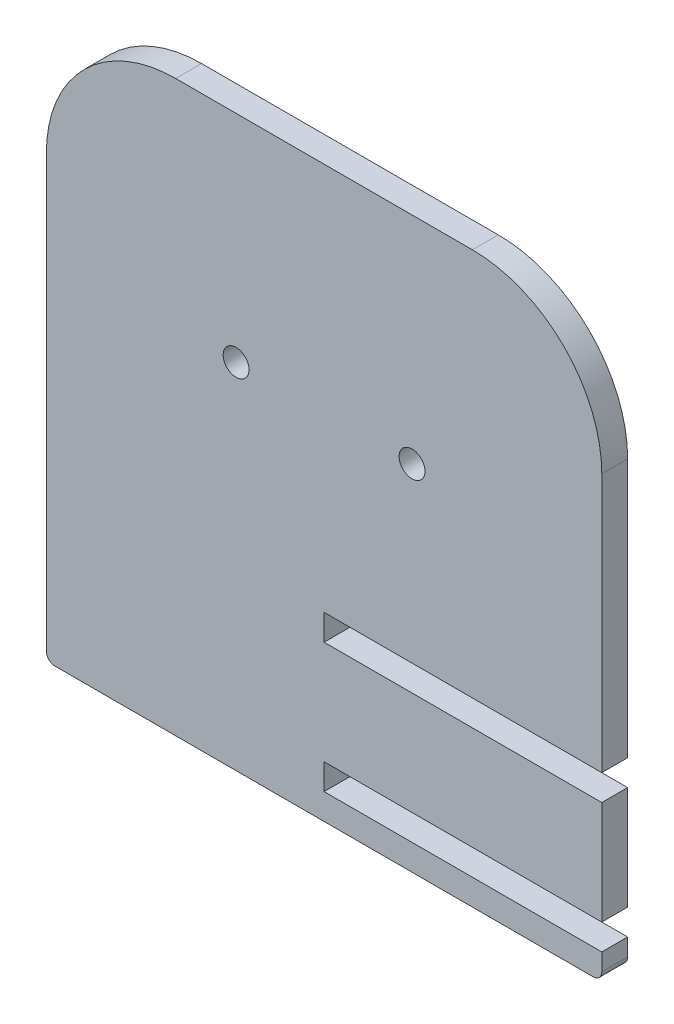
ISO-10303-21;
HEADER;
FILE_DESCRIPTION(('STEP AP214'),'2;1');
FILE_NAME('part.step','',(''),(''),'','','');
FILE_SCHEMA(('AUTOMOTIVE_DESIGN { 1 0 10303 214 1 1 1 1 }'));
ENDSEC;
DATA;
#1=APPLICATION_CONTEXT('core data for automotive mechanical design processes');
#2=APPLICATION_PROTOCOL_DEFINITION('international standard','automotive_design',2000,#1);
#3=PRODUCT_CONTEXT('',#1,'mechanical');
#4=PRODUCT('Part','Part','',(#3));
#5=PRODUCT_RELATED_PRODUCT_CATEGORY('part','',(#4));
#6=PRODUCT_DEFINITION_FORMATION('','',#4);
#7=PRODUCT_DEFINITION_CONTEXT('part definition',#1,'design');
#8=PRODUCT_DEFINITION('design','',#6,#7);
#9=PRODUCT_DEFINITION_SHAPE('','',#8);
#10=(LENGTH_UNIT() NAMED_UNIT(*) SI_UNIT(.MILLI.,.METRE.));
#11=(NAMED_UNIT(*) PLANE_ANGLE_UNIT() SI_UNIT($,.RADIAN.));
#12=(NAMED_UNIT(*) SI_UNIT($,.STERADIAN.) SOLID_ANGLE_UNIT());
#13=UNCERTAINTY_MEASURE_WITH_UNIT(LENGTH_MEASURE(1.E-05),#10,'distance_accuracy_value','');
#14=(GEOMETRIC_REPRESENTATION_CONTEXT(3) GLOBAL_UNCERTAINTY_ASSIGNED_CONTEXT((#13)) GLOBAL_UNIT_ASSIGNED_CONTEXT((#10,
#11,#12)) REPRESENTATION_CONTEXT('',''));
#15=CARTESIAN_POINT('',(0.,0.,0.));
#16=DIRECTION('',(0.,0.,1.));
#17=DIRECTION('',(1.,0.,0.));
#18=AXIS2_PLACEMENT_3D('',#15,#16,#17);
#19=CARTESIAN_POINT('',(2.73849644617079,-21.4850848039255,3.));
#20=DIRECTION('',(1.,0.,0.));
#21=DIRECTION('',(0.,1.,0.));
#22=AXIS2_PLACEMENT_3D('',#19,#20,#21);
#23=PLANE('',#22);
#24=DIRECTION('',(0.,0.,1.));
#25=VECTOR('',#24,1.);
#26=CARTESIAN_POINT('',(2.73849644617079,-51.4850848039256,0.));
#27=LINE('',#26,#25);
#28=CARTESIAN_POINT('',(2.73849644617079,-51.4850848039256,0.));
#29=VERTEX_POINT('',#28);
#30=CARTESIAN_POINT('',(2.73849644617079,-51.4850848039256,3.));
#31=VERTEX_POINT('',#30);
#32=EDGE_CURVE('E498',#29,#31,#27,.T.);
#33=ORIENTED_EDGE('',*,*,#32,.F.);
#34=DIRECTION('',(0.,-1.,0.));
#35=VECTOR('',#34,1.);
#36=CARTESIAN_POINT('',(2.73849644617079,-21.4850848039255,0.));
#37=LINE('',#36,#35);
#38=CARTESIAN_POINT('',(2.73849644617079,-21.4850848039255,0.));
#39=VERTEX_POINT('',#38);
#40=EDGE_CURVE('E197',#39,#29,#37,.T.);
#41=ORIENTED_EDGE('',*,*,#40,.F.);
#42=DIRECTION('',(0.,0.,-1.));
#43=VECTOR('',#42,1.);
#44=CARTESIAN_POINT('',(2.73849644617079,-21.4850848039255,3.));
#45=LINE('',#44,#43);
#46=CARTESIAN_POINT('',(2.73849644617079,-21.4850848039255,3.));
#47=VERTEX_POINT('',#46);
#48=EDGE_CURVE('E248',#47,#39,#45,.T.);
#49=ORIENTED_EDGE('',*,*,#48,.F.);
#50=DIRECTION('',(0.,-1.,0.));
#51=VECTOR('',#50,1.);
#52=CARTESIAN_POINT('',(2.73849644617079,-21.4850848039255,3.));
#53=LINE('',#52,#51);
#54=EDGE_CURVE('E285',#47,#31,#53,.T.);
#55=ORIENTED_EDGE('',*,*,#54,.T.);
#56=EDGE_LOOP('',(#33,#41,#49,#55));
#57=FACE_BOUND('',#56,.T.);
#58=ADVANCED_FACE('F45',(#57),#23,.T.);
#59=CARTESIAN_POINT('',(2.7384964461708,-69.4850848039256,3.));
#60=DIRECTION('',(0.,-1.,0.));
#61=DIRECTION('',(0.,0.,-1.));
#62=AXIS2_PLACEMENT_3D('',#59,#60,#61);
#63=PLANE('',#62);
#64=DIRECTION('',(-1.,0.,0.));
#65=VECTOR('',#64,1.);
#66=CARTESIAN_POINT('',(2.7384964461708,-69.4850848039256,0.));
#67=LINE('',#66,#65);
#68=CARTESIAN_POINT('',(2.7384964461708,-69.4850848039256,0.));
#69=VERTEX_POINT('',#68);
#70=CARTESIAN_POINT('',(-29.4615035538292,-69.4850848039256,0.));
#71=VERTEX_POINT('',#70);
#72=EDGE_CURVE('E184',#69,#71,#67,.T.);
#73=ORIENTED_EDGE('',*,*,#72,.T.);
#74=DIRECTION('',(0.,0.,-1.));
#75=VECTOR('',#74,1.);
#76=CARTESIAN_POINT('',(-29.4615035538292,-69.4850848039256,3.));
#77=LINE('',#76,#75);
#78=CARTESIAN_POINT('',(-29.4615035538292,-69.4850848039256,3.));
#79=VERTEX_POINT('',#78);
#80=EDGE_CURVE('E11',#79,#71,#77,.T.);
#81=ORIENTED_EDGE('',*,*,#80,.F.);
#82=DIRECTION('',(-1.,0.,0.));
#83=VECTOR('',#82,1.);
#84=CARTESIAN_POINT('',(2.7384964461708,-69.4850848039256,3.));
#85=LINE('',#84,#83);
#86=CARTESIAN_POINT('',(2.7384964461708,-69.4850848039256,3.));
#87=VERTEX_POINT('',#86);
#88=EDGE_CURVE('E120',#87,#79,#85,.T.);
#89=ORIENTED_EDGE('',*,*,#88,.F.);
#90=DIRECTION('',(0.,0.,-1.));
#91=VECTOR('',#90,1.);
#92=CARTESIAN_POINT('',(2.7384964461708,-69.4850848039256,3.));
#93=LINE('',#92,#91);
#94=EDGE_CURVE('E70',#87,#69,#93,.T.);
#95=ORIENTED_EDGE('',*,*,#94,.T.);
#96=EDGE_LOOP('',(#73,#81,#89,#95));
#97=FACE_BOUND('',#96,.T.);
#98=ADVANCED_FACE('F47',(#97),#63,.F.);
#99=CARTESIAN_POINT('',(-29.4615035538292,-66.4850848039255,3.));
#100=DIRECTION('',(1.,0.,0.));
#101=DIRECTION('',(0.,1.,0.));
#102=AXIS2_PLACEMENT_3D('',#99,#100,#101);
#103=PLANE('',#102);
#104=DIRECTION('',(0.,-1.,0.));
#105=VECTOR('',#104,1.);
#106=CARTESIAN_POINT('',(-29.4615035538292,-66.4850848039255,0.));
#107=LINE('',#106,#105);
#108=CARTESIAN_POINT('',(-29.4615035538292,-66.4850848039255,0.));
#109=VERTEX_POINT('',#108);
#110=EDGE_CURVE('E187',#109,#71,#107,.T.);
#111=ORIENTED_EDGE('',*,*,#110,.F.);
#112=DIRECTION('',(0.,0.,-1.));
#113=VECTOR('',#112,1.);
#114=CARTESIAN_POINT('',(-29.4615035538292,-66.4850848039255,3.));
#115=LINE('',#114,#113);
#116=CARTESIAN_POINT('',(-29.4615035538292,-66.4850848039255,3.));
#117=VERTEX_POINT('',#116);
#118=EDGE_CURVE('E54',#117,#109,#115,.T.);
#119=ORIENTED_EDGE('',*,*,#118,.F.);
#120=DIRECTION('',(0.,-1.,0.));
#121=VECTOR('',#120,1.);
#122=CARTESIAN_POINT('',(-29.4615035538292,-66.4850848039255,3.));
#123=LINE('',#122,#121);
#124=EDGE_CURVE('E280',#117,#79,#123,.T.);
#125=ORIENTED_EDGE('',*,*,#124,.T.);
#126=ORIENTED_EDGE('',*,*,#80,.T.);
#127=EDGE_LOOP('',(#111,#119,#125,#126));
#128=FACE_BOUND('',#127,.T.);
#129=ADVANCED_FACE('F265',(#128),#103,.T.);
#130=CARTESIAN_POINT('',(2.7384964461708,-66.4850848039255,3.));
#131=DIRECTION('',(0.,-1.,0.));
#132=DIRECTION('',(0.,0.,-1.));
#133=AXIS2_PLACEMENT_3D('',#130,#131,#132);
#134=PLANE('',#133);
#135=DIRECTION('',(-1.,0.,0.));
#136=VECTOR('',#135,1.);
#137=CARTESIAN_POINT('',(2.7384964461708,-66.4850848039255,0.));
#138=LINE('',#137,#136);
#139=CARTESIAN_POINT('',(2.7384964461708,-66.4850848039255,0.));
#140=VERTEX_POINT('',#139);
#141=EDGE_CURVE('E192',#140,#109,#138,.T.);
#142=ORIENTED_EDGE('',*,*,#141,.F.);
#143=DIRECTION('',(0.,0.,-1.));
#144=VECTOR('',#143,1.);
#145=CARTESIAN_POINT('',(2.7384964461708,-66.4850848039255,3.));
#146=LINE('',#145,#144);
#147=CARTESIAN_POINT('',(2.7384964461708,-66.4850848039255,3.));
#148=VERTEX_POINT('',#147);
#149=EDGE_CURVE('E251',#148,#140,#146,.T.);
#150=ORIENTED_EDGE('',*,*,#149,.F.);
#151=DIRECTION('',(-1.,0.,0.));
#152=VECTOR('',#151,1.);
#153=CARTESIAN_POINT('',(2.7384964461708,-66.4850848039255,3.));
#154=LINE('',#153,#152);
#155=EDGE_CURVE('E262',#148,#117,#154,.T.);
#156=ORIENTED_EDGE('',*,*,#155,.T.);
#157=ORIENTED_EDGE('',*,*,#118,.T.);
#158=EDGE_LOOP('',(#142,#150,#156,#157));
#159=FACE_BOUND('',#158,.T.);
#160=ADVANCED_FACE('F259',(#159),#134,.T.);
#161=DIRECTION('',(0.,0.,1.));
#162=VECTOR('',#161,1.);
#163=CARTESIAN_POINT('',(2.73849644617079,-54.4850848039256,0.));
#164=LINE('',#163,#162);
#165=CARTESIAN_POINT('',(2.7384964461708,-54.4850848039255,0.));
#166=VERTEX_POINT('',#165);
#167=CARTESIAN_POINT('',(2.73849644617079,-54.4850848039256,3.));
#168=VERTEX_POINT('',#167);
#169=EDGE_CURVE('E61',#166,#168,#164,.T.);
#170=ORIENTED_EDGE('',*,*,#169,.T.);
#171=EDGE_CURVE('E277',#168,#148,#53,.T.);
#172=ORIENTED_EDGE('',*,*,#171,.T.);
#173=ORIENTED_EDGE('',*,*,#149,.T.);
#174=EDGE_CURVE('E196',#166,#140,#37,.T.);
#175=ORIENTED_EDGE('',*,*,#174,.F.);
#176=EDGE_LOOP('',(#170,#172,#173,#175));
#177=FACE_BOUND('',#176,.T.);
#178=ADVANCED_FACE('F275',(#177),#23,.T.);
#179=CARTESIAN_POINT('',(-12.2615035538292,-21.4850848039256,3.));
#180=DIRECTION('',(0.,0.,-1.));
#181=DIRECTION('',(-1.,0.,0.));
#182=AXIS2_PLACEMENT_3D('',#179,#180,#181);
#183=CYLINDRICAL_SURFACE('',#182,15.);
#184=CARTESIAN_POINT('',(-12.2615035538292,-21.4850848039256,0.));
#185=DIRECTION('',(0.,0.,-1.));
#186=DIRECTION('',(-1.,0.,0.));
#187=AXIS2_PLACEMENT_3D('',#184,#185,#186);
#188=CIRCLE('',#187,15.);
#189=CARTESIAN_POINT('',(-12.2615035538292,-6.48508480392555,0.));
#190=VERTEX_POINT('',#189);
#191=EDGE_CURVE('E201',#190,#39,#188,.T.);
#192=ORIENTED_EDGE('',*,*,#191,.F.);
#193=DIRECTION('',(0.,0.,-1.));
#194=VECTOR('',#193,1.);
#195=CARTESIAN_POINT('',(-12.2615035538292,-6.48508480392555,3.));
#196=LINE('',#195,#194);
#197=CARTESIAN_POINT('',(-12.2615035538292,-6.48508480392555,3.));
#198=VERTEX_POINT('',#197);
#199=EDGE_CURVE('E245',#198,#190,#196,.T.);
#200=ORIENTED_EDGE('',*,*,#199,.F.);
#201=CARTESIAN_POINT('',(-12.2615035538292,-21.4850848039256,3.));
#202=DIRECTION('',(0.,0.,-1.));
#203=DIRECTION('',(-1.,0.,0.));
#204=AXIS2_PLACEMENT_3D('',#201,#202,#203);
#205=CIRCLE('',#204,15.);
#206=EDGE_CURVE('E292',#198,#47,#205,.T.);
#207=ORIENTED_EDGE('',*,*,#206,.T.);
#208=ORIENTED_EDGE('',*,*,#48,.T.);
#209=EDGE_LOOP('',(#192,#200,#207,#208));
#210=FACE_BOUND('',#209,.T.);
#211=ADVANCED_FACE('F339',(#210),#183,.T.);
#212=CARTESIAN_POINT('',(-46.6615035538292,-6.48508480392555,3.));
#213=DIRECTION('',(0.,1.,0.));
#214=DIRECTION('',(0.,0.,1.));
#215=AXIS2_PLACEMENT_3D('',#212,#213,#214);
#216=PLANE('',#215);
#217=DIRECTION('',(1.,0.,0.));
#218=VECTOR('',#217,1.);
#219=CARTESIAN_POINT('',(-46.6615035538292,-6.48508480392555,0.));
#220=LINE('',#219,#218);
#221=CARTESIAN_POINT('',(-46.6615035538292,-6.48508480392556,0.));
#222=VERTEX_POINT('',#221);
#223=EDGE_CURVE('E205',#222,#190,#220,.T.);
#224=ORIENTED_EDGE('',*,*,#223,.F.);
#225=DIRECTION('',(0.,0.,-1.));
#226=VECTOR('',#225,1.);
#227=CARTESIAN_POINT('',(-46.6615035538292,-6.48508480392556,3.));
#228=LINE('',#227,#226);
#229=CARTESIAN_POINT('',(-46.6615035538292,-6.48508480392556,3.));
#230=VERTEX_POINT('',#229);
#231=EDGE_CURVE('E242',#230,#222,#228,.T.);
#232=ORIENTED_EDGE('',*,*,#231,.F.);
#233=DIRECTION('',(1.,0.,0.));
#234=VECTOR('',#233,1.);
#235=CARTESIAN_POINT('',(-46.6615035538292,-6.48508480392555,3.));
#236=LINE('',#235,#234);
#237=EDGE_CURVE('E296',#230,#198,#236,.T.);
#238=ORIENTED_EDGE('',*,*,#237,.T.);
#239=ORIENTED_EDGE('',*,*,#199,.T.);
#240=EDGE_LOOP('',(#224,#232,#238,#239));
#241=FACE_BOUND('',#240,.T.);
#242=ADVANCED_FACE('F343',(#241),#216,.T.);
#243=CARTESIAN_POINT('',(-46.6615035538292,-21.4850848039256,3.));
#244=DIRECTION('',(0.,0.,-1.));
#245=DIRECTION('',(-1.,0.,0.));
#246=AXIS2_PLACEMENT_3D('',#243,#244,#245);
#247=CYLINDRICAL_SURFACE('',#246,15.);
#248=CARTESIAN_POINT('',(-46.6615035538292,-21.4850848039256,0.));
#249=DIRECTION('',(0.,0.,1.));
#250=DIRECTION('',(1.,0.,0.));
#251=AXIS2_PLACEMENT_3D('',#248,#249,#250);
#252=CIRCLE('',#251,15.);
#253=CARTESIAN_POINT('',(-61.6615035538292,-21.4850848039256,0.));
#254=VERTEX_POINT('',#253);
#255=EDGE_CURVE('E209',#222,#254,#252,.T.);
#256=ORIENTED_EDGE('',*,*,#255,.T.);
#257=DIRECTION('',(0.,0.,-1.));
#258=VECTOR('',#257,1.);
#259=CARTESIAN_POINT('',(-61.6615035538292,-21.4850848039256,3.));
#260=LINE('',#259,#258);
#261=CARTESIAN_POINT('',(-61.6615035538292,-21.4850848039256,3.));
#262=VERTEX_POINT('',#261);
#263=EDGE_CURVE('E238',#262,#254,#260,.T.);
#264=ORIENTED_EDGE('',*,*,#263,.F.);
#265=CARTESIAN_POINT('',(-46.6615035538292,-21.4850848039256,3.));
#266=DIRECTION('',(0.,0.,1.));
#267=DIRECTION('',(1.,0.,0.));
#268=AXIS2_PLACEMENT_3D('',#265,#266,#267);
#269=CIRCLE('',#268,15.);
#270=EDGE_CURVE('E300',#230,#262,#269,.T.);
#271=ORIENTED_EDGE('',*,*,#270,.F.);
#272=ORIENTED_EDGE('',*,*,#231,.T.);
#273=EDGE_LOOP('',(#256,#264,#271,#272));
#274=FACE_BOUND('',#273,.T.);
#275=ADVANCED_FACE('F379',(#274),#247,.T.);
#276=CARTESIAN_POINT('',(-61.6615035538292,-54.4850848039256,3.));
#277=DIRECTION('',(1.,0.,0.));
#278=DIRECTION('',(0.,0.,-1.));
#279=AXIS2_PLACEMENT_3D('',#276,#277,#278);
#280=PLANE('',#279);
#281=DIRECTION('',(0.,-1.,0.));
#282=VECTOR('',#281,1.);
#283=CARTESIAN_POINT('',(-61.6615035538292,-54.4850848039256,0.));
#284=LINE('',#283,#282);
#285=CARTESIAN_POINT('',(-61.6615035538292,-71.4850848039255,0.));
#286=VERTEX_POINT('',#285);
#287=EDGE_CURVE('E213',#254,#286,#284,.T.);
#288=ORIENTED_EDGE('',*,*,#287,.T.);
#289=DIRECTION('',(0.,0.,-1.));
#290=VECTOR('',#289,1.);
#291=CARTESIAN_POINT('',(-61.6615035538292,-71.4850848039255,3.));
#292=LINE('',#291,#290);
#293=CARTESIAN_POINT('',(-61.6615035538292,-71.4850848039255,3.));
#294=VERTEX_POINT('',#293);
#295=EDGE_CURVE('E234',#294,#286,#292,.T.);
#296=ORIENTED_EDGE('',*,*,#295,.F.);
#297=DIRECTION('',(0.,-1.,0.));
#298=VECTOR('',#297,1.);
#299=CARTESIAN_POINT('',(-61.6615035538292,-21.4850848039256,3.));
#300=LINE('',#299,#298);
#301=EDGE_CURVE('E303',#262,#294,#300,.T.);
#302=ORIENTED_EDGE('',*,*,#301,.F.);
#303=ORIENTED_EDGE('',*,*,#263,.T.);
#304=EDGE_LOOP('',(#288,#296,#302,#303));
#305=FACE_BOUND('',#304,.T.);
#306=ADVANCED_FACE('F312',(#305),#280,.F.);
#307=CARTESIAN_POINT('',(-60.6615035538292,-71.4850848039255,3.));
#308=DIRECTION('',(0.,0.,-1.));
#309=DIRECTION('',(-1.,0.,0.));
#310=AXIS2_PLACEMENT_3D('',#307,#308,#309);
#311=CYLINDRICAL_SURFACE('',#310,1.00000000000002);
#312=CARTESIAN_POINT('',(-60.6615035538292,-71.4850848039255,0.));
#313=DIRECTION('',(0.,0.,1.));
#314=DIRECTION('',(1.,0.,0.));
#315=AXIS2_PLACEMENT_3D('',#312,#313,#314);
#316=CIRCLE('',#315,1.00000000000002);
#317=CARTESIAN_POINT('',(-60.6615035538292,-72.4850848039256,0.));
#318=VERTEX_POINT('',#317);
#319=EDGE_CURVE('E216',#286,#318,#316,.T.);
#320=ORIENTED_EDGE('',*,*,#319,.T.);
#321=DIRECTION('',(0.,0.,-1.));
#322=VECTOR('',#321,1.);
#323=CARTESIAN_POINT('',(-60.6615035538292,-72.4850848039256,3.));
#324=LINE('',#323,#322);
#325=CARTESIAN_POINT('',(-60.6615035538292,-72.4850848039256,3.));
#326=VERTEX_POINT('',#325);
#327=EDGE_CURVE('E173',#326,#318,#324,.T.);
#328=ORIENTED_EDGE('',*,*,#327,.F.);
#329=CARTESIAN_POINT('',(-60.6615035538292,-71.4850848039255,3.));
#330=DIRECTION('',(0.,0.,1.));
#331=DIRECTION('',(1.,0.,0.));
#332=AXIS2_PLACEMENT_3D('',#329,#330,#331);
#333=CIRCLE('',#332,1.00000000000002);
#334=EDGE_CURVE('E158',#294,#326,#333,.T.);
#335=ORIENTED_EDGE('',*,*,#334,.F.);
#336=ORIENTED_EDGE('',*,*,#295,.T.);
#337=EDGE_LOOP('',(#320,#328,#335,#336));
#338=FACE_BOUND('',#337,.T.);
#339=ADVANCED_FACE('F315',(#338),#311,.T.);
#340=CARTESIAN_POINT('',(-60.6615035538292,-72.4850848039256,3.));
#341=DIRECTION('',(0.,1.,0.));
#342=DIRECTION('',(-1.,0.,0.));
#343=AXIS2_PLACEMENT_3D('',#340,#341,#342);
#344=PLANE('',#343);
#345=DIRECTION('',(1.,0.,0.));
#346=VECTOR('',#345,1.);
#347=CARTESIAN_POINT('',(-60.6615035538292,-72.4850848039256,0.));
#348=LINE('',#347,#346);
#349=CARTESIAN_POINT('',(1.73849644617078,-72.4850848039256,0.));
#350=VERTEX_POINT('',#349);
#351=EDGE_CURVE('E168',#318,#350,#348,.T.);
#352=ORIENTED_EDGE('',*,*,#351,.T.);
#353=DIRECTION('',(0.,0.,-1.));
#354=VECTOR('',#353,1.);
#355=CARTESIAN_POINT('',(1.73849644617078,-72.4850848039256,3.));
#356=LINE('',#355,#354);
#357=CARTESIAN_POINT('',(1.73849644617078,-72.4850848039256,3.));
#358=VERTEX_POINT('',#357);
#359=EDGE_CURVE('E165',#358,#350,#356,.T.);
#360=ORIENTED_EDGE('',*,*,#359,.F.);
#361=DIRECTION('',(1.,0.,0.));
#362=VECTOR('',#361,1.);
#363=CARTESIAN_POINT('',(-60.6615035538292,-72.4850848039256,3.));
#364=LINE('',#363,#362);
#365=EDGE_CURVE('E150',#326,#358,#364,.T.);
#366=ORIENTED_EDGE('',*,*,#365,.F.);
#367=ORIENTED_EDGE('',*,*,#327,.T.);
#368=EDGE_LOOP('',(#352,#360,#366,#367));
#369=FACE_BOUND('',#368,.T.);
#370=ADVANCED_FACE('F166',(#369),#344,.F.);
#371=CARTESIAN_POINT('',(1.73849644617078,-71.4850848039256,3.));
#372=DIRECTION('',(0.,0.,-1.));
#373=DIRECTION('',(-1.,0.,0.));
#374=AXIS2_PLACEMENT_3D('',#371,#372,#373);
#375=CYLINDRICAL_SURFACE('',#374,1.00000000000002);
#376=CARTESIAN_POINT('',(1.73849644617078,-71.4850848039256,0.));
#377=DIRECTION('',(0.,0.,1.));
#378=DIRECTION('',(1.,0.,0.));
#379=AXIS2_PLACEMENT_3D('',#376,#377,#378);
#380=CIRCLE('',#379,1.00000000000002);
#381=CARTESIAN_POINT('',(2.7384964461708,-71.4850848039256,0.));
#382=VERTEX_POINT('',#381);
#383=EDGE_CURVE('E221',#350,#382,#380,.T.);
#384=ORIENTED_EDGE('',*,*,#383,.T.);
#385=DIRECTION('',(0.,0.,-1.));
#386=VECTOR('',#385,1.);
#387=CARTESIAN_POINT('',(2.7384964461708,-71.4850848039256,3.));
#388=LINE('',#387,#386);
#389=CARTESIAN_POINT('',(2.7384964461708,-71.4850848039256,3.));
#390=VERTEX_POINT('',#389);
#391=EDGE_CURVE('E174',#390,#382,#388,.T.);
#392=ORIENTED_EDGE('',*,*,#391,.F.);
#393=CARTESIAN_POINT('',(1.73849644617078,-71.4850848039256,3.));
#394=DIRECTION('',(0.,0.,1.));
#395=DIRECTION('',(1.,0.,0.));
#396=AXIS2_PLACEMENT_3D('',#393,#394,#395);
#397=CIRCLE('',#396,1.00000000000002);
#398=EDGE_CURVE('E155',#358,#390,#397,.T.);
#399=ORIENTED_EDGE('',*,*,#398,.F.);
#400=ORIENTED_EDGE('',*,*,#359,.T.);
#401=EDGE_LOOP('',(#384,#392,#399,#400));
#402=FACE_BOUND('',#401,.T.);
#403=ADVANCED_FACE('F176',(#402),#375,.T.);
#404=CARTESIAN_POINT('',(2.7384964461708,-69.4850848039256,3.));
#405=DIRECTION('',(1.,0.,0.));
#406=DIRECTION('',(0.,1.,0.));
#407=AXIS2_PLACEMENT_3D('',#404,#405,#406);
#408=PLANE('',#407);
#409=DIRECTION('',(0.,-1.,0.));
#410=VECTOR('',#409,1.);
#411=CARTESIAN_POINT('',(2.7384964461708,-69.4850848039256,0.));
#412=LINE('',#411,#410);
#413=EDGE_CURVE('E224',#69,#382,#412,.T.);
#414=ORIENTED_EDGE('',*,*,#413,.F.);
#415=ORIENTED_EDGE('',*,*,#94,.F.);
#416=DIRECTION('',(0.,-1.,0.));
#417=VECTOR('',#416,1.);
#418=CARTESIAN_POINT('',(2.7384964461708,-69.4850848039256,3.));
#419=LINE('',#418,#417);
#420=EDGE_CURVE('E178',#87,#390,#419,.T.);
#421=ORIENTED_EDGE('',*,*,#420,.T.);
#422=ORIENTED_EDGE('',*,*,#391,.T.);
#423=EDGE_LOOP('',(#414,#415,#421,#422));
#424=FACE_BOUND('',#423,.T.);
#425=ADVANCED_FACE('F316',(#424),#408,.T.);
#426=CARTESIAN_POINT('',(-12.2615035538292,-21.4850848039256,3.));
#427=DIRECTION('',(0.,0.,-1.));
#428=DIRECTION('',(-1.,0.,0.));
#429=AXIS2_PLACEMENT_3D('',#426,#427,#428);
#430=PLANE('',#429);
#431=CARTESIAN_POINT('',(-19.2615035538292,-31.4850848039256,3.));
#432=DIRECTION('',(0.,0.,1.));
#433=DIRECTION('',(1.,0.,0.));
#434=AXIS2_PLACEMENT_3D('',#431,#432,#433);
#435=CIRCLE('',#434,1.5);
#436=CARTESIAN_POINT('',(-17.7615035538292,-31.4850848039256,3.));
#437=VERTEX_POINT('',#436);
#438=EDGE_CURVE('E512',#437,#437,#435,.T.);
#439=ORIENTED_EDGE('',*,*,#438,.F.);
#440=EDGE_LOOP('',(#439));
#441=FACE_BOUND('',#440,.T.);
#442=CARTESIAN_POINT('',(-39.6615035538292,-31.4850848039256,3.));
#443=DIRECTION('',(0.,0.,1.));
#444=DIRECTION('',(1.,0.,0.));
#445=AXIS2_PLACEMENT_3D('',#442,#443,#444);
#446=CIRCLE('',#445,1.5);
#447=CARTESIAN_POINT('',(-38.1615035538292,-31.4850848039256,3.));
#448=VERTEX_POINT('',#447);
#449=EDGE_CURVE('E516',#448,#448,#446,.T.);
#450=ORIENTED_EDGE('',*,*,#449,.F.);
#451=EDGE_LOOP('',(#450));
#452=FACE_BOUND('',#451,.T.);
#453=DIRECTION('',(0.,-1.,0.));
#454=VECTOR('',#453,1.);
#455=CARTESIAN_POINT('',(-29.4615035538292,-51.4850848039256,3.));
#456=LINE('',#455,#454);
#457=CARTESIAN_POINT('',(-29.4615035538292,-51.4850848039256,3.));
#458=VERTEX_POINT('',#457);
#459=CARTESIAN_POINT('',(-29.4615035538292,-54.4850848039256,3.));
#460=VERTEX_POINT('',#459);
#461=EDGE_CURVE('E495',#458,#460,#456,.T.);
#462=ORIENTED_EDGE('',*,*,#461,.F.);
#463=DIRECTION('',(-1.,0.,0.));
#464=VECTOR('',#463,1.);
#465=CARTESIAN_POINT('',(-29.4615035538292,-51.4850848039256,3.));
#466=LINE('',#465,#464);
#467=EDGE_CURVE('E494',#31,#458,#466,.T.);
#468=ORIENTED_EDGE('',*,*,#467,.F.);
#469=ORIENTED_EDGE('',*,*,#54,.F.);
#470=ORIENTED_EDGE('',*,*,#206,.F.);
#471=ORIENTED_EDGE('',*,*,#237,.F.);
#472=ORIENTED_EDGE('',*,*,#270,.T.);
#473=ORIENTED_EDGE('',*,*,#301,.T.);
#474=ORIENTED_EDGE('',*,*,#334,.T.);
#475=ORIENTED_EDGE('',*,*,#365,.T.);
#476=ORIENTED_EDGE('',*,*,#398,.T.);
#477=ORIENTED_EDGE('',*,*,#420,.F.);
#478=ORIENTED_EDGE('',*,*,#88,.T.);
#479=ORIENTED_EDGE('',*,*,#124,.F.);
#480=ORIENTED_EDGE('',*,*,#155,.F.);
#481=ORIENTED_EDGE('',*,*,#171,.F.);
#482=DIRECTION('',(1.,0.,0.));
#483=VECTOR('',#482,1.);
#484=CARTESIAN_POINT('',(-29.4615035538292,-54.4850848039256,3.));
#485=LINE('',#484,#483);
#486=EDGE_CURVE('E486',#460,#168,#485,.T.);
#487=ORIENTED_EDGE('',*,*,#486,.F.);
#488=EDGE_LOOP('',(#462,#468,#469,#470,#471,#472,#473,#474,#475,#476,#477,#478,#479,#480,#481,#487));
#489=FACE_BOUND('',#488,.T.);
#490=ADVANCED_FACE('F153',(#441,#452,#489),#430,.F.);
#491=CARTESIAN_POINT('',(-12.2615035538292,-21.4850848039256,0.));
#492=DIRECTION('',(0.,0.,-1.));
#493=DIRECTION('',(-1.,0.,0.));
#494=AXIS2_PLACEMENT_3D('',#491,#492,#493);
#495=PLANE('',#494);
#496=DIRECTION('',(-1.,0.,0.));
#497=VECTOR('',#496,1.);
#498=CARTESIAN_POINT('',(-29.4615035538292,-51.4850848039256,0.));
#499=LINE('',#498,#497);
#500=CARTESIAN_POINT('',(-29.4615035538292,-51.4850848039256,0.));
#501=VERTEX_POINT('',#500);
#502=EDGE_CURVE('E505',#29,#501,#499,.T.);
#503=ORIENTED_EDGE('',*,*,#502,.T.);
#504=DIRECTION('',(0.,-1.,0.));
#505=VECTOR('',#504,1.);
#506=CARTESIAN_POINT('',(-29.4615035538292,-51.4850848039256,0.));
#507=LINE('',#506,#505);
#508=CARTESIAN_POINT('',(-29.4615035538292,-54.4850848039256,0.));
#509=VERTEX_POINT('',#508);
#510=EDGE_CURVE('E531',#501,#509,#507,.T.);
#511=ORIENTED_EDGE('',*,*,#510,.T.);
#512=DIRECTION('',(1.,0.,0.));
#513=VECTOR('',#512,1.);
#514=CARTESIAN_POINT('',(-29.4615035538292,-54.4850848039256,0.));
#515=LINE('',#514,#513);
#516=EDGE_CURVE('E272',#509,#166,#515,.T.);
#517=ORIENTED_EDGE('',*,*,#516,.T.);
#518=ORIENTED_EDGE('',*,*,#174,.T.);
#519=ORIENTED_EDGE('',*,*,#141,.T.);
#520=ORIENTED_EDGE('',*,*,#110,.T.);
#521=ORIENTED_EDGE('',*,*,#72,.F.);
#522=ORIENTED_EDGE('',*,*,#413,.T.);
#523=ORIENTED_EDGE('',*,*,#383,.F.);
#524=ORIENTED_EDGE('',*,*,#351,.F.);
#525=ORIENTED_EDGE('',*,*,#319,.F.);
#526=ORIENTED_EDGE('',*,*,#287,.F.);
#527=ORIENTED_EDGE('',*,*,#255,.F.);
#528=ORIENTED_EDGE('',*,*,#223,.T.);
#529=ORIENTED_EDGE('',*,*,#191,.T.);
#530=ORIENTED_EDGE('',*,*,#40,.T.);
#531=EDGE_LOOP('',(#503,#511,#517,#518,#519,#520,#521,#522,#523,#524,#525,#526,#527,#528,#529,#530));
#532=FACE_BOUND('',#531,.T.);
#533=CARTESIAN_POINT('',(-19.2615035538292,-31.4850848039256,0.));
#534=DIRECTION('',(0.,0.,1.));
#535=DIRECTION('',(1.,0.,0.));
#536=AXIS2_PLACEMENT_3D('',#533,#534,#535);
#537=CIRCLE('',#536,1.5);
#538=CARTESIAN_POINT('',(-17.7615035538292,-31.4850848039256,0.));
#539=VERTEX_POINT('',#538);
#540=EDGE_CURVE('E188',#539,#539,#537,.T.);
#541=ORIENTED_EDGE('',*,*,#540,.T.);
#542=EDGE_LOOP('',(#541));
#543=FACE_BOUND('',#542,.T.);
#544=CARTESIAN_POINT('',(-39.6615035538292,-31.4850848039256,0.));
#545=DIRECTION('',(0.,0.,1.));
#546=DIRECTION('',(1.,0.,0.));
#547=AXIS2_PLACEMENT_3D('',#544,#545,#546);
#548=CIRCLE('',#547,1.5);
#549=CARTESIAN_POINT('',(-38.1615035538292,-31.4850848039256,0.));
#550=VERTEX_POINT('',#549);
#551=EDGE_CURVE('E520',#550,#550,#548,.T.);
#552=ORIENTED_EDGE('',*,*,#551,.T.);
#553=EDGE_LOOP('',(#552));
#554=FACE_BOUND('',#553,.T.);
#555=ADVANCED_FACE('F268',(#532,#543,#554),#495,.T.);
#556=CARTESIAN_POINT('',(-39.6615035538292,-31.4850848039256,0.));
#557=DIRECTION('',(0.,0.,1.));
#558=DIRECTION('',(1.,0.,0.));
#559=AXIS2_PLACEMENT_3D('',#556,#557,#558);
#560=CYLINDRICAL_SURFACE('',#559,1.5);
#561=ORIENTED_EDGE('',*,*,#551,.F.);
#562=EDGE_LOOP('',(#561));
#563=FACE_BOUND('',#562,.T.);
#564=ORIENTED_EDGE('',*,*,#449,.T.);
#565=EDGE_LOOP('',(#564));
#566=FACE_BOUND('',#565,.T.);
#567=ADVANCED_FACE('F433',(#563,#566),#560,.F.);
#568=CARTESIAN_POINT('',(-19.2615035538292,-31.4850848039256,0.));
#569=DIRECTION('',(0.,0.,1.));
#570=DIRECTION('',(1.,0.,0.));
#571=AXIS2_PLACEMENT_3D('',#568,#569,#570);
#572=CYLINDRICAL_SURFACE('',#571,1.5);
#573=ORIENTED_EDGE('',*,*,#540,.F.);
#574=EDGE_LOOP('',(#573));
#575=FACE_BOUND('',#574,.T.);
#576=ORIENTED_EDGE('',*,*,#438,.T.);
#577=EDGE_LOOP('',(#576));
#578=FACE_BOUND('',#577,.T.);
#579=ADVANCED_FACE('F439',(#575,#578),#572,.F.);
#580=CARTESIAN_POINT('',(-29.4615035538292,-51.4850848039256,0.));
#581=DIRECTION('',(-1.,0.,0.));
#582=DIRECTION('',(0.,0.,1.));
#583=AXIS2_PLACEMENT_3D('',#580,#581,#582);
#584=PLANE('',#583);
#585=ORIENTED_EDGE('',*,*,#461,.T.);
#586=DIRECTION('',(0.,0.,1.));
#587=VECTOR('',#586,1.);
#588=CARTESIAN_POINT('',(-29.4615035538292,-54.4850848039256,0.));
#589=LINE('',#588,#587);
#590=EDGE_CURVE('E489',#509,#460,#589,.T.);
#591=ORIENTED_EDGE('',*,*,#590,.F.);
#592=ORIENTED_EDGE('',*,*,#510,.F.);
#593=DIRECTION('',(0.,0.,1.));
#594=VECTOR('',#593,1.);
#595=CARTESIAN_POINT('',(-29.4615035538292,-51.4850848039256,0.));
#596=LINE('',#595,#594);
#597=EDGE_CURVE('E503',#501,#458,#596,.T.);
#598=ORIENTED_EDGE('',*,*,#597,.T.);
#599=EDGE_LOOP('',(#585,#591,#592,#598));
#600=FACE_BOUND('',#599,.T.);
#601=ADVANCED_FACE('F446',(#600),#584,.F.);
#602=CARTESIAN_POINT('',(-29.4615035538292,-51.4850848039256,0.));
#603=DIRECTION('',(0.,1.,0.));
#604=DIRECTION('',(0.,0.,1.));
#605=AXIS2_PLACEMENT_3D('',#602,#603,#604);
#606=PLANE('',#605);
#607=ORIENTED_EDGE('',*,*,#467,.T.);
#608=ORIENTED_EDGE('',*,*,#597,.F.);
#609=ORIENTED_EDGE('',*,*,#502,.F.);
#610=ORIENTED_EDGE('',*,*,#32,.T.);
#611=EDGE_LOOP('',(#607,#608,#609,#610));
#612=FACE_BOUND('',#611,.T.);
#613=ADVANCED_FACE('F460',(#612),#606,.F.);
#614=CARTESIAN_POINT('',(-29.4615035538292,-54.4850848039256,0.));
#615=DIRECTION('',(0.,-1.,0.));
#616=DIRECTION('',(0.,0.,-1.));
#617=AXIS2_PLACEMENT_3D('',#614,#615,#616);
#618=PLANE('',#617);
#619=ORIENTED_EDGE('',*,*,#486,.T.);
#620=ORIENTED_EDGE('',*,*,#169,.F.);
#621=ORIENTED_EDGE('',*,*,#516,.F.);
#622=ORIENTED_EDGE('',*,*,#590,.T.);
#623=EDGE_LOOP('',(#619,#620,#621,#622));
#624=FACE_BOUND('',#623,.T.);
#625=ADVANCED_FACE('F469',(#624),#618,.F.);
#626=CLOSED_SHELL('',(#58,#98,#129,#160,#178,#211,#242,#275,#306,#339,#370,#403,#425,#490,#555,
#567,#579,#601,#613,#625));
#627=MANIFOLD_SOLID_BREP('B2',#626);
#628=ADVANCED_BREP_SHAPE_REPRESENTATION('',(#18,#627),#14);
#629=SHAPE_DEFINITION_REPRESENTATION(#9,#628);
ENDSEC;
END-ISO-10303-21;
